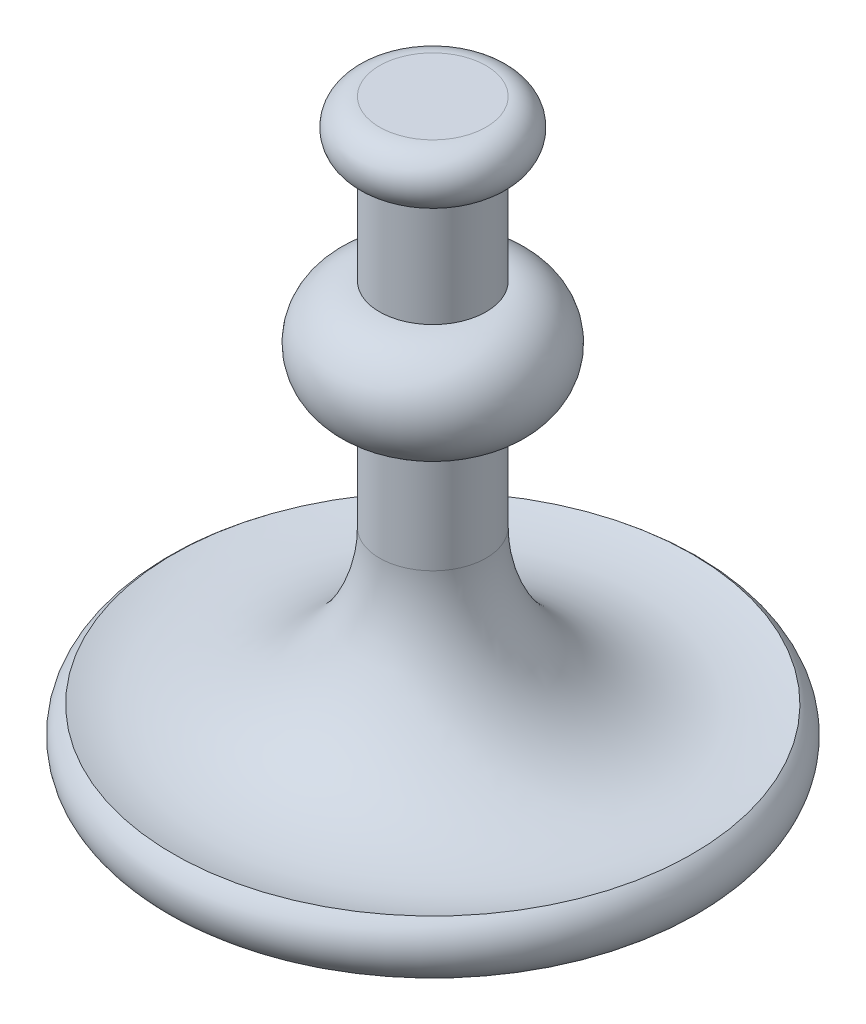
ISO-10303-21;
HEADER;
FILE_DESCRIPTION(('STEP AP214'),'2;1');
FILE_NAME('part.step','',(''),(''),'','','');
FILE_SCHEMA(('AUTOMOTIVE_DESIGN { 1 0 10303 214 1 1 1 1 }'));
ENDSEC;
DATA;
#1=APPLICATION_CONTEXT('core data for automotive mechanical design processes');
#2=APPLICATION_PROTOCOL_DEFINITION('international standard','automotive_design',2000,#1);
#3=PRODUCT_CONTEXT('',#1,'mechanical');
#4=PRODUCT('Part','Part','',(#3));
#5=PRODUCT_RELATED_PRODUCT_CATEGORY('part','',(#4));
#6=PRODUCT_DEFINITION_FORMATION('','',#4);
#7=PRODUCT_DEFINITION_CONTEXT('part definition',#1,'design');
#8=PRODUCT_DEFINITION('design','',#6,#7);
#9=PRODUCT_DEFINITION_SHAPE('','',#8);
#10=(LENGTH_UNIT() NAMED_UNIT(*) SI_UNIT(.MILLI.,.METRE.));
#11=(NAMED_UNIT(*) PLANE_ANGLE_UNIT() SI_UNIT($,.RADIAN.));
#12=(NAMED_UNIT(*) SI_UNIT($,.STERADIAN.) SOLID_ANGLE_UNIT());
#13=UNCERTAINTY_MEASURE_WITH_UNIT(LENGTH_MEASURE(1.E-05),#10,'distance_accuracy_value','');
#14=(GEOMETRIC_REPRESENTATION_CONTEXT(3) GLOBAL_UNCERTAINTY_ASSIGNED_CONTEXT((#13)) GLOBAL_UNIT_ASSIGNED_CONTEXT((#10,
#11,#12)) REPRESENTATION_CONTEXT('',''));
#15=CARTESIAN_POINT('',(0.,0.,0.));
#16=DIRECTION('',(0.,0.,1.));
#17=DIRECTION('',(1.,0.,0.));
#18=AXIS2_PLACEMENT_3D('',#15,#16,#17);
#19=CARTESIAN_POINT('',(-90.,12.5,0.));
#20=DIRECTION('',(0.,-1.,0.));
#21=DIRECTION('',(0.,0.,-1.));
#22=AXIS2_PLACEMENT_3D('',#19,#20,#21);
#23=TOROIDAL_SURFACE('',#22,90.,12.5);
#24=CARTESIAN_POINT('',(-90.,22.5771812080537,0.));
#25=DIRECTION('',(0.,-1.,0.));
#26=DIRECTION('',(0.,0.,-1.));
#27=AXIS2_PLACEMENT_3D('',#24,#25,#26);
#28=CIRCLE('',#27,97.3959731543624);
#29=CARTESIAN_POINT('',(-90.,22.5771812080537,-97.3959731543624));
#30=VERTEX_POINT('',#29);
#31=EDGE_CURVE('E10',#30,#30,#28,.T.);
#32=ORIENTED_EDGE('',*,*,#31,.T.);
#33=EDGE_LOOP('',(#32));
#34=FACE_BOUND('',#33,.T.);
#35=CARTESIAN_POINT('',(-90.,0.,0.));
#36=DIRECTION('',(0.,-1.,0.));
#37=DIRECTION('',(0.,0.,-1.));
#38=AXIS2_PLACEMENT_3D('',#35,#36,#37);
#39=CIRCLE('',#38,90.);
#40=CARTESIAN_POINT('',(-90.,0.,-90.));
#41=VERTEX_POINT('',#40);
#42=EDGE_CURVE('E62',#41,#41,#39,.T.);
#43=ORIENTED_EDGE('',*,*,#42,.F.);
#44=EDGE_LOOP('',(#43));
#45=FACE_BOUND('',#44,.T.);
#46=ADVANCED_FACE('F37',(#34,#45),#23,.T.);
#47=CARTESIAN_POINT('',(-90.,80.,0.));
#48=DIRECTION('',(0.,-1.,0.));
#49=DIRECTION('',(0.,0.,-1.));
#50=AXIS2_PLACEMENT_3D('',#47,#48,#49);
#51=TOROIDAL_SURFACE('',#50,80.,60.);
#52=CARTESIAN_POINT('',(-90.,80.,0.));
#53=DIRECTION('',(0.,-1.,0.));
#54=DIRECTION('',(0.,0.,-1.));
#55=AXIS2_PLACEMENT_3D('',#52,#53,#54);
#56=CIRCLE('',#55,20.);
#57=CARTESIAN_POINT('',(-90.,80.,-20.));
#58=VERTEX_POINT('',#57);
#59=EDGE_CURVE('E43',#58,#58,#56,.T.);
#60=ORIENTED_EDGE('',*,*,#59,.T.);
#61=EDGE_LOOP('',(#60));
#62=FACE_BOUND('',#61,.T.);
#63=ORIENTED_EDGE('',*,*,#31,.F.);
#64=EDGE_LOOP('',(#63));
#65=FACE_BOUND('',#64,.T.);
#66=ADVANCED_FACE('F69',(#62,#65),#51,.F.);
#67=CARTESIAN_POINT('',(-90.,0.,0.));
#68=DIRECTION('',(0.,-1.,0.));
#69=DIRECTION('',(0.,0.,-1.));
#70=AXIS2_PLACEMENT_3D('',#67,#68,#69);
#71=CYLINDRICAL_SURFACE('',#70,20.);
#72=CARTESIAN_POINT('',(-90.,120.,0.));
#73=DIRECTION('',(0.,-1.,0.));
#74=DIRECTION('',(0.,0.,-1.));
#75=AXIS2_PLACEMENT_3D('',#72,#73,#74);
#76=CIRCLE('',#75,20.);
#77=CARTESIAN_POINT('',(-90.,120.,-20.));
#78=VERTEX_POINT('',#77);
#79=EDGE_CURVE('E47',#78,#78,#76,.T.);
#80=ORIENTED_EDGE('',*,*,#79,.T.);
#81=EDGE_LOOP('',(#80));
#82=FACE_BOUND('',#81,.T.);
#83=ORIENTED_EDGE('',*,*,#59,.F.);
#84=EDGE_LOOP('',(#83));
#85=FACE_BOUND('',#84,.T.);
#86=ADVANCED_FACE('F73',(#82,#85),#71,.T.);
#87=CARTESIAN_POINT('',(-90.,140.,0.));
#88=DIRECTION('',(0.,-1.,0.));
#89=DIRECTION('',(0.,0.,-1.));
#90=AXIS2_PLACEMENT_3D('',#87,#88,#89);
#91=TOROIDAL_SURFACE('',#90,20.,20.);
#92=CARTESIAN_POINT('',(-90.,160.,0.));
#93=DIRECTION('',(0.,-1.,0.));
#94=DIRECTION('',(0.,0.,-1.));
#95=AXIS2_PLACEMENT_3D('',#92,#93,#94);
#96=CIRCLE('',#95,20.);
#97=CARTESIAN_POINT('',(-90.,160.,-20.));
#98=VERTEX_POINT('',#97);
#99=EDGE_CURVE('E51',#98,#98,#96,.T.);
#100=ORIENTED_EDGE('',*,*,#99,.T.);
#101=EDGE_LOOP('',(#100));
#102=FACE_BOUND('',#101,.T.);
#103=ORIENTED_EDGE('',*,*,#79,.F.);
#104=EDGE_LOOP('',(#103));
#105=FACE_BOUND('',#104,.T.);
#106=ADVANCED_FACE('F77',(#102,#105),#91,.T.);
#107=CARTESIAN_POINT('',(-90.,0.,0.));
#108=DIRECTION('',(0.,-1.,0.));
#109=DIRECTION('',(0.,0.,-1.));
#110=AXIS2_PLACEMENT_3D('',#107,#108,#109);
#111=CYLINDRICAL_SURFACE('',#110,20.);
#112=CARTESIAN_POINT('',(-90.,200.,0.));
#113=DIRECTION('',(0.,-1.,0.));
#114=DIRECTION('',(0.,0.,-1.));
#115=AXIS2_PLACEMENT_3D('',#112,#113,#114);
#116=CIRCLE('',#115,20.);
#117=CARTESIAN_POINT('',(-90.,200.,-20.));
#118=VERTEX_POINT('',#117);
#119=EDGE_CURVE('E56',#118,#118,#116,.T.);
#120=ORIENTED_EDGE('',*,*,#119,.T.);
#121=EDGE_LOOP('',(#120));
#122=FACE_BOUND('',#121,.T.);
#123=ORIENTED_EDGE('',*,*,#99,.F.);
#124=EDGE_LOOP('',(#123));
#125=FACE_BOUND('',#124,.T.);
#126=ADVANCED_FACE('F84',(#122,#125),#111,.T.);
#127=CARTESIAN_POINT('',(-90.,210.,0.));
#128=DIRECTION('',(0.,-1.,0.));
#129=DIRECTION('',(0.,0.,-1.));
#130=AXIS2_PLACEMENT_3D('',#127,#128,#129);
#131=TOROIDAL_SURFACE('',#130,20.,9.99999999999999);
#132=CARTESIAN_POINT('',(-90.,220.,0.));
#133=DIRECTION('',(0.,-1.,0.));
#134=DIRECTION('',(0.,0.,-1.));
#135=AXIS2_PLACEMENT_3D('',#132,#133,#134);
#136=CIRCLE('',#135,20.);
#137=CARTESIAN_POINT('',(-90.,220.,-20.));
#138=VERTEX_POINT('',#137);
#139=EDGE_CURVE('E59',#138,#138,#136,.T.);
#140=ORIENTED_EDGE('',*,*,#139,.T.);
#141=EDGE_LOOP('',(#140));
#142=FACE_BOUND('',#141,.T.);
#143=ORIENTED_EDGE('',*,*,#119,.F.);
#144=EDGE_LOOP('',(#143));
#145=FACE_BOUND('',#144,.T.);
#146=ADVANCED_FACE('F88',(#142,#145),#131,.T.);
#147=CARTESIAN_POINT('',(-90.,220.,0.));
#148=DIRECTION('',(0.,1.,0.));
#149=DIRECTION('',(0.,0.,1.));
#150=AXIS2_PLACEMENT_3D('',#147,#148,#149);
#151=PLANE('',#150);
#152=ORIENTED_EDGE('',*,*,#139,.F.);
#153=EDGE_LOOP('',(#152));
#154=FACE_BOUND('',#153,.T.);
#155=ADVANCED_FACE('F92',(#154),#151,.T.);
#156=CARTESIAN_POINT('',(0.,0.,0.));
#157=DIRECTION('',(0.,-1.,0.));
#158=DIRECTION('',(0.,0.,-1.));
#159=AXIS2_PLACEMENT_3D('',#156,#157,#158);
#160=PLANE('',#159);
#161=ORIENTED_EDGE('',*,*,#42,.T.);
#162=EDGE_LOOP('',(#161));
#163=FACE_BOUND('',#162,.T.);
#164=ADVANCED_FACE('F66',(#163),#160,.T.);
#165=CLOSED_SHELL('',(#46,#66,#86,#106,#126,#146,#155,#164));
#166=MANIFOLD_SOLID_BREP('B2',#165);
#167=ADVANCED_BREP_SHAPE_REPRESENTATION('',(#18,#166),#14);
#168=SHAPE_DEFINITION_REPRESENTATION(#9,#167);
ENDSEC;
END-ISO-10303-21;
